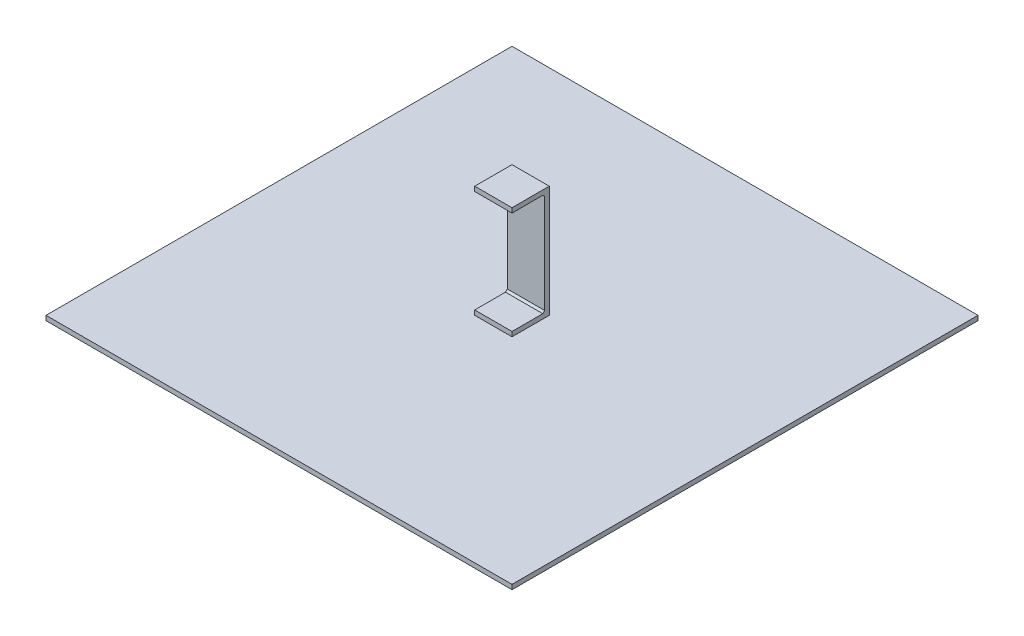
ISO-10303-21;
HEADER;
FILE_DESCRIPTION(('STEP AP214'),'2;1');
FILE_NAME('part.step','',(''),(''),'','','');
FILE_SCHEMA(('AUTOMOTIVE_DESIGN { 1 0 10303 214 1 1 1 1 }'));
ENDSEC;
DATA;
#1=APPLICATION_CONTEXT('core data for automotive mechanical design processes');
#2=APPLICATION_PROTOCOL_DEFINITION('international standard','automotive_design',2000,#1);
#3=PRODUCT_CONTEXT('',#1,'mechanical');
#4=PRODUCT('Part','Part','',(#3));
#5=PRODUCT_RELATED_PRODUCT_CATEGORY('part','',(#4));
#6=PRODUCT_DEFINITION_FORMATION('','',#4);
#7=PRODUCT_DEFINITION_CONTEXT('part definition',#1,'design');
#8=PRODUCT_DEFINITION('design','',#6,#7);
#9=PRODUCT_DEFINITION_SHAPE('','',#8);
#10=(LENGTH_UNIT() NAMED_UNIT(*) SI_UNIT(.MILLI.,.METRE.));
#11=(NAMED_UNIT(*) PLANE_ANGLE_UNIT() SI_UNIT($,.RADIAN.));
#12=(NAMED_UNIT(*) SI_UNIT($,.STERADIAN.) SOLID_ANGLE_UNIT());
#13=UNCERTAINTY_MEASURE_WITH_UNIT(LENGTH_MEASURE(1.E-05),#10,'distance_accuracy_value','');
#14=(GEOMETRIC_REPRESENTATION_CONTEXT(3) GLOBAL_UNCERTAINTY_ASSIGNED_CONTEXT((#13)) GLOBAL_UNIT_ASSIGNED_CONTEXT((#10,
#11,#12)) REPRESENTATION_CONTEXT('',''));
#15=CARTESIAN_POINT('',(0.,0.,0.));
#16=DIRECTION('',(0.,0.,1.));
#17=DIRECTION('',(1.,0.,0.));
#18=AXIS2_PLACEMENT_3D('',#15,#16,#17);
#19=CARTESIAN_POINT('',(0.,-1200.,0.));
#20=DIRECTION('',(0.,-1.,0.));
#21=DIRECTION('',(0.,0.,-1.));
#22=AXIS2_PLACEMENT_3D('',#19,#20,#21);
#23=PLANE('',#22);
#24=DIRECTION('',(0.,0.,1.));
#25=VECTOR('',#24,1.);
#26=CARTESIAN_POINT('',(2700.,-1200.,2404.98516938128));
#27=LINE('',#26,#25);
#28=CARTESIAN_POINT('',(2700.,-1200.,-2595.01483061872));
#29=VERTEX_POINT('',#28);
#30=CARTESIAN_POINT('',(2700.,-1200.,2404.98516938128));
#31=VERTEX_POINT('',#30);
#32=EDGE_CURVE('E146',#29,#31,#27,.T.);
#33=ORIENTED_EDGE('',*,*,#32,.T.);
#34=DIRECTION('',(-1.,0.,0.));
#35=VECTOR('',#34,1.);
#36=CARTESIAN_POINT('',(-2300.,-1200.,2404.98516938128));
#37=LINE('',#36,#35);
#38=CARTESIAN_POINT('',(-2300.,-1200.,2404.98516938128));
#39=VERTEX_POINT('',#38);
#40=EDGE_CURVE('E149',#31,#39,#37,.T.);
#41=ORIENTED_EDGE('',*,*,#40,.T.);
#42=DIRECTION('',(0.,0.,-1.));
#43=VECTOR('',#42,1.);
#44=CARTESIAN_POINT('',(-2300.,-1200.,2404.98516938128));
#45=LINE('',#44,#43);
#46=CARTESIAN_POINT('',(-2300.,-1200.,-2595.01483061872));
#47=VERTEX_POINT('',#46);
#48=EDGE_CURVE('E152',#39,#47,#45,.T.);
#49=ORIENTED_EDGE('',*,*,#48,.T.);
#50=DIRECTION('',(1.,0.,0.));
#51=VECTOR('',#50,1.);
#52=CARTESIAN_POINT('',(-2300.,-1200.,-2595.01483061872));
#53=LINE('',#52,#51);
#54=EDGE_CURVE('E154',#47,#29,#53,.T.);
#55=ORIENTED_EDGE('',*,*,#54,.T.);
#56=EDGE_LOOP('',(#33,#41,#49,#55));
#57=FACE_BOUND('',#56,.T.);
#58=DIRECTION('',(0.,0.,-1.));
#59=VECTOR('',#58,1.);
#60=CARTESIAN_POINT('',(0.,-1200.,104.985169381277));
#61=LINE('',#60,#59);
#62=CARTESIAN_POINT('',(0.,-1200.,104.985169381277));
#63=VERTEX_POINT('',#62);
#64=CARTESIAN_POINT('',(0.,-1200.,-295.014830618723));
#65=VERTEX_POINT('',#64);
#66=EDGE_CURVE('E118',#63,#65,#61,.T.);
#67=ORIENTED_EDGE('',*,*,#66,.F.);
#68=DIRECTION('',(-1.,0.,0.));
#69=VECTOR('',#68,1.);
#70=CARTESIAN_POINT('',(400.,-1200.,104.985169381277));
#71=LINE('',#70,#69);
#72=CARTESIAN_POINT('',(400.,-1200.,104.985169381277));
#73=VERTEX_POINT('',#72);
#74=EDGE_CURVE('E110',#73,#63,#71,.T.);
#75=ORIENTED_EDGE('',*,*,#74,.F.);
#76=DIRECTION('',(0.,0.,1.));
#77=VECTOR('',#76,1.);
#78=CARTESIAN_POINT('',(400.,-1200.,-295.014830618723));
#79=LINE('',#78,#77);
#80=CARTESIAN_POINT('',(400.,-1200.,-295.014830618723));
#81=VERTEX_POINT('',#80);
#82=EDGE_CURVE('E132',#81,#73,#79,.T.);
#83=ORIENTED_EDGE('',*,*,#82,.F.);
#84=DIRECTION('',(1.,0.,0.));
#85=VECTOR('',#84,1.);
#86=CARTESIAN_POINT('',(0.,-1200.,-295.014830618723));
#87=LINE('',#86,#85);
#88=EDGE_CURVE('E130',#65,#81,#87,.T.);
#89=ORIENTED_EDGE('',*,*,#88,.F.);
#90=EDGE_LOOP('',(#67,#75,#83,#89));
#91=FACE_BOUND('',#90,.T.);
#92=ADVANCED_FACE('F45',(#57,#91),#23,.T.);
#93=CARTESIAN_POINT('',(0.,-1150.,0.));
#94=DIRECTION('',(0.,-1.,0.));
#95=DIRECTION('',(0.,0.,-1.));
#96=AXIS2_PLACEMENT_3D('',#93,#94,#95);
#97=PLANE('',#96);
#98=DIRECTION('',(0.,0.,1.));
#99=VECTOR('',#98,1.);
#100=CARTESIAN_POINT('',(2700.,-1150.,2404.98516938128));
#101=LINE('',#100,#99);
#102=CARTESIAN_POINT('',(2700.,-1150.,-2595.01483061872));
#103=VERTEX_POINT('',#102);
#104=CARTESIAN_POINT('',(2700.,-1150.,2404.98516938128));
#105=VERTEX_POINT('',#104);
#106=EDGE_CURVE('E126',#103,#105,#101,.T.);
#107=ORIENTED_EDGE('',*,*,#106,.F.);
#108=DIRECTION('',(1.,0.,0.));
#109=VECTOR('',#108,1.);
#110=CARTESIAN_POINT('',(-2300.,-1150.,-2595.01483061872));
#111=LINE('',#110,#109);
#112=CARTESIAN_POINT('',(-2300.,-1150.,-2595.01483061872));
#113=VERTEX_POINT('',#112);
#114=EDGE_CURVE('E150',#113,#103,#111,.T.);
#115=ORIENTED_EDGE('',*,*,#114,.F.);
#116=DIRECTION('',(0.,0.,-1.));
#117=VECTOR('',#116,1.);
#118=CARTESIAN_POINT('',(-2300.,-1150.,2404.98516938128));
#119=LINE('',#118,#117);
#120=CARTESIAN_POINT('',(-2300.,-1150.,2404.98516938128));
#121=VERTEX_POINT('',#120);
#122=EDGE_CURVE('E161',#121,#113,#119,.T.);
#123=ORIENTED_EDGE('',*,*,#122,.F.);
#124=DIRECTION('',(-1.,0.,0.));
#125=VECTOR('',#124,1.);
#126=CARTESIAN_POINT('',(-2300.,-1150.,2404.98516938128));
#127=LINE('',#126,#125);
#128=EDGE_CURVE('E159',#105,#121,#127,.T.);
#129=ORIENTED_EDGE('',*,*,#128,.F.);
#130=EDGE_LOOP('',(#107,#115,#123,#129));
#131=FACE_BOUND('',#130,.T.);
#132=DIRECTION('',(-1.,0.,0.));
#133=VECTOR('',#132,1.);
#134=CARTESIAN_POINT('',(400.,-1150.,104.985169381277));
#135=LINE('',#134,#133);
#136=CARTESIAN_POINT('',(400.,-1150.,104.985169381277));
#137=VERTEX_POINT('',#136);
#138=CARTESIAN_POINT('',(0.,-1150.,104.985169381277));
#139=VERTEX_POINT('',#138);
#140=EDGE_CURVE('E68',#137,#139,#135,.T.);
#141=ORIENTED_EDGE('',*,*,#140,.T.);
#142=DIRECTION('',(0.,0.,-1.));
#143=VECTOR('',#142,1.);
#144=CARTESIAN_POINT('',(0.,-1150.,104.985169381277));
#145=LINE('',#144,#143);
#146=CARTESIAN_POINT('',(0.,-1150.,-295.014830618723));
#147=VERTEX_POINT('',#146);
#148=EDGE_CURVE('E125',#139,#147,#145,.T.);
#149=ORIENTED_EDGE('',*,*,#148,.T.);
#150=DIRECTION('',(1.,0.,0.));
#151=VECTOR('',#150,1.);
#152=CARTESIAN_POINT('',(0.,-1150.,-295.014830618723));
#153=LINE('',#152,#151);
#154=CARTESIAN_POINT('',(400.,-1150.,-295.014830618723));
#155=VERTEX_POINT('',#154);
#156=EDGE_CURVE('E138',#147,#155,#153,.T.);
#157=ORIENTED_EDGE('',*,*,#156,.T.);
#158=DIRECTION('',(0.,0.,1.));
#159=VECTOR('',#158,1.);
#160=CARTESIAN_POINT('',(400.,-1150.,-295.014830618723));
#161=LINE('',#160,#159);
#162=EDGE_CURVE('E119',#155,#137,#161,.T.);
#163=ORIENTED_EDGE('',*,*,#162,.T.);
#164=EDGE_LOOP('',(#141,#149,#157,#163));
#165=FACE_BOUND('',#164,.T.);
#166=ADVANCED_FACE('F179',(#131,#165),#97,.F.);
#167=CARTESIAN_POINT('',(2700.,-1200.,2404.98516938128));
#168=DIRECTION('',(-1.,0.,0.));
#169=DIRECTION('',(0.,0.,1.));
#170=AXIS2_PLACEMENT_3D('',#167,#168,#169);
#171=PLANE('',#170);
#172=ORIENTED_EDGE('',*,*,#106,.T.);
#173=DIRECTION('',(0.,1.,0.));
#174=VECTOR('',#173,1.);
#175=CARTESIAN_POINT('',(2700.,-1200.,2404.98516938128));
#176=LINE('',#175,#174);
#177=EDGE_CURVE('E12',#31,#105,#176,.T.);
#178=ORIENTED_EDGE('',*,*,#177,.F.);
#179=ORIENTED_EDGE('',*,*,#32,.F.);
#180=DIRECTION('',(0.,1.,0.));
#181=VECTOR('',#180,1.);
#182=CARTESIAN_POINT('',(2700.,-1200.,-2595.01483061872));
#183=LINE('',#182,#181);
#184=EDGE_CURVE('E156',#29,#103,#183,.T.);
#185=ORIENTED_EDGE('',*,*,#184,.T.);
#186=EDGE_LOOP('',(#172,#178,#179,#185));
#187=FACE_BOUND('',#186,.T.);
#188=ADVANCED_FACE('F47',(#187),#171,.F.);
#189=CARTESIAN_POINT('',(-2300.,-1200.,2404.98516938128));
#190=DIRECTION('',(0.,0.,-1.));
#191=DIRECTION('',(-1.,0.,0.));
#192=AXIS2_PLACEMENT_3D('',#189,#190,#191);
#193=PLANE('',#192);
#194=ORIENTED_EDGE('',*,*,#128,.T.);
#195=DIRECTION('',(0.,1.,0.));
#196=VECTOR('',#195,1.);
#197=CARTESIAN_POINT('',(-2300.,-1200.,2404.98516938128));
#198=LINE('',#197,#196);
#199=EDGE_CURVE('E53',#39,#121,#198,.T.);
#200=ORIENTED_EDGE('',*,*,#199,.F.);
#201=ORIENTED_EDGE('',*,*,#40,.F.);
#202=ORIENTED_EDGE('',*,*,#177,.T.);
#203=EDGE_LOOP('',(#194,#200,#201,#202));
#204=FACE_BOUND('',#203,.T.);
#205=ADVANCED_FACE('F189',(#204),#193,.F.);
#206=CARTESIAN_POINT('',(-2300.,-1200.,2404.98516938128));
#207=DIRECTION('',(1.,0.,0.));
#208=DIRECTION('',(0.,0.,-1.));
#209=AXIS2_PLACEMENT_3D('',#206,#207,#208);
#210=PLANE('',#209);
#211=ORIENTED_EDGE('',*,*,#122,.T.);
#212=DIRECTION('',(0.,1.,0.));
#213=VECTOR('',#212,1.);
#214=CARTESIAN_POINT('',(-2300.,-1200.,-2595.01483061872));
#215=LINE('',#214,#213);
#216=EDGE_CURVE('E166',#47,#113,#215,.T.);
#217=ORIENTED_EDGE('',*,*,#216,.F.);
#218=ORIENTED_EDGE('',*,*,#48,.F.);
#219=ORIENTED_EDGE('',*,*,#199,.T.);
#220=EDGE_LOOP('',(#211,#217,#218,#219));
#221=FACE_BOUND('',#220,.T.);
#222=ADVANCED_FACE('F173',(#221),#210,.F.);
#223=CARTESIAN_POINT('',(-2300.,-1200.,-2595.01483061872));
#224=DIRECTION('',(0.,0.,1.));
#225=DIRECTION('',(1.,0.,0.));
#226=AXIS2_PLACEMENT_3D('',#223,#224,#225);
#227=PLANE('',#226);
#228=ORIENTED_EDGE('',*,*,#114,.T.);
#229=ORIENTED_EDGE('',*,*,#184,.F.);
#230=ORIENTED_EDGE('',*,*,#54,.F.);
#231=ORIENTED_EDGE('',*,*,#216,.T.);
#232=EDGE_LOOP('',(#228,#229,#230,#231));
#233=FACE_BOUND('',#232,.T.);
#234=ADVANCED_FACE('F183',(#233),#227,.F.);
#235=CARTESIAN_POINT('',(400.,-1200.,104.985169381277));
#236=DIRECTION('',(0.,0.,-1.));
#237=DIRECTION('',(-1.,0.,0.));
#238=AXIS2_PLACEMENT_3D('',#235,#236,#237);
#239=PLANE('',#238);
#240=ORIENTED_EDGE('',*,*,#140,.F.);
#241=DIRECTION('',(0.,1.,0.));
#242=VECTOR('',#241,1.);
#243=CARTESIAN_POINT('',(400.,-1200.,104.985169381277));
#244=LINE('',#243,#242);
#245=EDGE_CURVE('E114',#73,#137,#244,.T.);
#246=ORIENTED_EDGE('',*,*,#245,.F.);
#247=ORIENTED_EDGE('',*,*,#74,.T.);
#248=DIRECTION('',(0.,1.,0.));
#249=VECTOR('',#248,1.);
#250=CARTESIAN_POINT('',(0.,-1200.,104.985169381277));
#251=LINE('',#250,#249);
#252=EDGE_CURVE('E113',#63,#139,#251,.T.);
#253=ORIENTED_EDGE('',*,*,#252,.T.);
#254=EDGE_LOOP('',(#240,#246,#247,#253));
#255=FACE_BOUND('',#254,.T.);
#256=ADVANCED_FACE('F112',(#255),#239,.T.);
#257=CARTESIAN_POINT('',(0.,-1200.,104.985169381277));
#258=DIRECTION('',(1.,0.,0.));
#259=DIRECTION('',(0.,0.,-1.));
#260=AXIS2_PLACEMENT_3D('',#257,#258,#259);
#261=PLANE('',#260);
#262=ORIENTED_EDGE('',*,*,#148,.F.);
#263=ORIENTED_EDGE('',*,*,#252,.F.);
#264=ORIENTED_EDGE('',*,*,#66,.T.);
#265=DIRECTION('',(0.,1.,0.));
#266=VECTOR('',#265,1.);
#267=CARTESIAN_POINT('',(0.,-1200.,-295.014830618723));
#268=LINE('',#267,#266);
#269=EDGE_CURVE('E127',#65,#147,#268,.T.);
#270=ORIENTED_EDGE('',*,*,#269,.T.);
#271=EDGE_LOOP('',(#262,#263,#264,#270));
#272=FACE_BOUND('',#271,.T.);
#273=ADVANCED_FACE('F122',(#272),#261,.T.);
#274=CARTESIAN_POINT('',(0.,-1200.,-295.014830618723));
#275=DIRECTION('',(0.,0.,1.));
#276=DIRECTION('',(1.,0.,0.));
#277=AXIS2_PLACEMENT_3D('',#274,#275,#276);
#278=PLANE('',#277);
#279=ORIENTED_EDGE('',*,*,#156,.F.);
#280=ORIENTED_EDGE('',*,*,#269,.F.);
#281=ORIENTED_EDGE('',*,*,#88,.T.);
#282=DIRECTION('',(0.,1.,0.));
#283=VECTOR('',#282,1.);
#284=CARTESIAN_POINT('',(400.,-1200.,-295.014830618723));
#285=LINE('',#284,#283);
#286=EDGE_CURVE('E60',#81,#155,#285,.T.);
#287=ORIENTED_EDGE('',*,*,#286,.T.);
#288=EDGE_LOOP('',(#279,#280,#281,#287));
#289=FACE_BOUND('',#288,.T.);
#290=ADVANCED_FACE('F212',(#289),#278,.T.);
#291=CARTESIAN_POINT('',(400.,-1200.,-295.014830618723));
#292=DIRECTION('',(-1.,0.,0.));
#293=DIRECTION('',(0.,0.,1.));
#294=AXIS2_PLACEMENT_3D('',#291,#292,#293);
#295=PLANE('',#294);
#296=ORIENTED_EDGE('',*,*,#162,.F.);
#297=ORIENTED_EDGE('',*,*,#286,.F.);
#298=ORIENTED_EDGE('',*,*,#82,.T.);
#299=ORIENTED_EDGE('',*,*,#245,.T.);
#300=EDGE_LOOP('',(#296,#297,#298,#299));
#301=FACE_BOUND('',#300,.T.);
#302=ADVANCED_FACE('F216',(#301),#295,.T.);
#303=CLOSED_SHELL('',(#92,#166,#188,#205,#222,#234,#256,#273,#290,#302));
#304=MANIFOLD_SOLID_BREP('B2',#303);
#305=CARTESIAN_POINT('',(400.,0.,104.985169381277));
#306=DIRECTION('',(0.,0.,-1.));
#307=DIRECTION('',(-1.,0.,0.));
#308=AXIS2_PLACEMENT_3D('',#305,#306,#307);
#309=PLANE('',#308);
#310=DIRECTION('',(0.,-1.,0.));
#311=VECTOR('',#310,1.);
#312=CARTESIAN_POINT('',(0.,0.,104.985169381277));
#313=LINE('',#312,#311);
#314=CARTESIAN_POINT('',(0.,50.,104.985169381277));
#315=VERTEX_POINT('',#314);
#316=CARTESIAN_POINT('',(0.,0.,104.985169381277));
#317=VERTEX_POINT('',#316);
#318=EDGE_CURVE('E370',#315,#317,#313,.T.);
#319=ORIENTED_EDGE('',*,*,#318,.T.);
#320=DIRECTION('',(-1.,0.,0.));
#321=VECTOR('',#320,1.);
#322=CARTESIAN_POINT('',(400.,0.,104.985169381277));
#323=LINE('',#322,#321);
#324=CARTESIAN_POINT('',(400.,0.,104.985169381277));
#325=VERTEX_POINT('',#324);
#326=EDGE_CURVE('E353',#325,#317,#323,.T.);
#327=ORIENTED_EDGE('',*,*,#326,.F.);
#328=DIRECTION('',(0.,-1.,0.));
#329=VECTOR('',#328,1.);
#330=CARTESIAN_POINT('',(400.,0.,104.985169381277));
#331=LINE('',#330,#329);
#332=CARTESIAN_POINT('',(400.,50.,104.985169381277));
#333=VERTEX_POINT('',#332);
#334=EDGE_CURVE('E358',#333,#325,#331,.T.);
#335=ORIENTED_EDGE('',*,*,#334,.F.);
#336=DIRECTION('',(-1.,0.,0.));
#337=VECTOR('',#336,1.);
#338=CARTESIAN_POINT('',(400.,50.,104.985169381277));
#339=LINE('',#338,#337);
#340=EDGE_CURVE('E427',#333,#315,#339,.T.);
#341=ORIENTED_EDGE('',*,*,#340,.T.);
#342=EDGE_LOOP('',(#319,#327,#335,#341));
#343=FACE_BOUND('',#342,.T.);
#344=ADVANCED_FACE('F275',(#343),#309,.F.);
#345=CARTESIAN_POINT('',(400.,0.,-245.014830618723));
#346=DIRECTION('',(0.,1.,0.));
#347=DIRECTION('',(0.,0.,1.));
#348=AXIS2_PLACEMENT_3D('',#345,#346,#347);
#349=PLANE('',#348);
#350=DIRECTION('',(0.,0.,-1.));
#351=VECTOR('',#350,1.);
#352=CARTESIAN_POINT('',(0.,0.,-245.014830618723));
#353=LINE('',#352,#351);
#354=CARTESIAN_POINT('',(0.,0.,-225.014830618723));
#355=VERTEX_POINT('',#354);
#356=EDGE_CURVE('E414',#317,#355,#353,.T.);
#357=ORIENTED_EDGE('',*,*,#356,.T.);
#358=DIRECTION('',(1.,0.,0.));
#359=VECTOR('',#358,1.);
#360=CARTESIAN_POINT('',(400.,0.,-225.014830618723));
#361=LINE('',#360,#359);
#362=CARTESIAN_POINT('',(400.,0.,-225.014830618723));
#363=VERTEX_POINT('',#362);
#364=EDGE_CURVE('E291',#355,#363,#361,.T.);
#365=ORIENTED_EDGE('',*,*,#364,.T.);
#366=DIRECTION('',(0.,0.,-1.));
#367=VECTOR('',#366,1.);
#368=CARTESIAN_POINT('',(400.,0.,-245.014830618723));
#369=LINE('',#368,#367);
#370=EDGE_CURVE('E349',#325,#363,#369,.T.);
#371=ORIENTED_EDGE('',*,*,#370,.F.);
#372=ORIENTED_EDGE('',*,*,#326,.T.);
#373=EDGE_LOOP('',(#357,#365,#371,#372));
#374=FACE_BOUND('',#373,.T.);
#375=ADVANCED_FACE('F351',(#374),#349,.F.);
#376=CARTESIAN_POINT('',(400.,-1100.,-245.014830618723));
#377=DIRECTION('',(0.,0.,-1.));
#378=DIRECTION('',(-1.,0.,0.));
#379=AXIS2_PLACEMENT_3D('',#376,#377,#378);
#380=PLANE('',#379);
#381=DIRECTION('',(0.,-1.,0.));
#382=VECTOR('',#381,1.);
#383=CARTESIAN_POINT('',(0.,-1100.,-245.014830618723));
#384=LINE('',#383,#382);
#385=CARTESIAN_POINT('',(0.,-20.0000000000002,-245.014830618723));
#386=VERTEX_POINT('',#385);
#387=CARTESIAN_POINT('',(0.,-1080.,-245.014830618723));
#388=VERTEX_POINT('',#387);
#389=EDGE_CURVE('E408',#386,#388,#384,.T.);
#390=ORIENTED_EDGE('',*,*,#389,.T.);
#391=DIRECTION('',(1.,0.,0.));
#392=VECTOR('',#391,1.);
#393=CARTESIAN_POINT('',(400.,-1080.,-245.014830618723));
#394=LINE('',#393,#392);
#395=CARTESIAN_POINT('',(400.,-1080.,-245.014830618723));
#396=VERTEX_POINT('',#395);
#397=EDGE_CURVE('E384',#388,#396,#394,.T.);
#398=ORIENTED_EDGE('',*,*,#397,.T.);
#399=DIRECTION('',(0.,-1.,0.));
#400=VECTOR('',#399,1.);
#401=CARTESIAN_POINT('',(400.,-1100.,-245.014830618723));
#402=LINE('',#401,#400);
#403=CARTESIAN_POINT('',(400.,-20.0000000000002,-245.014830618723));
#404=VERTEX_POINT('',#403);
#405=EDGE_CURVE('E357',#404,#396,#402,.T.);
#406=ORIENTED_EDGE('',*,*,#405,.F.);
#407=DIRECTION('',(-1.,0.,0.));
#408=VECTOR('',#407,1.);
#409=CARTESIAN_POINT('',(0.,-20.0000000000002,-245.014830618723));
#410=LINE('',#409,#408);
#411=EDGE_CURVE('E375',#404,#386,#410,.T.);
#412=ORIENTED_EDGE('',*,*,#411,.T.);
#413=EDGE_LOOP('',(#390,#398,#406,#412));
#414=FACE_BOUND('',#413,.T.);
#415=ADVANCED_FACE('F412',(#414),#380,.F.);
#416=CARTESIAN_POINT('',(400.,-1100.,104.985169381277));
#417=DIRECTION('',(0.,-1.,0.));
#418=DIRECTION('',(0.,0.,-1.));
#419=AXIS2_PLACEMENT_3D('',#416,#417,#418);
#420=PLANE('',#419);
#421=DIRECTION('',(0.,0.,1.));
#422=VECTOR('',#421,1.);
#423=CARTESIAN_POINT('',(400.,-1100.,104.985169381277));
#424=LINE('',#423,#422);
#425=CARTESIAN_POINT('',(400.,-1100.,-225.014830618723));
#426=VERTEX_POINT('',#425);
#427=CARTESIAN_POINT('',(400.,-1100.,104.985169381277));
#428=VERTEX_POINT('',#427);
#429=EDGE_CURVE('E393',#426,#428,#424,.T.);
#430=ORIENTED_EDGE('',*,*,#429,.F.);
#431=DIRECTION('',(-1.,0.,0.));
#432=VECTOR('',#431,1.);
#433=CARTESIAN_POINT('',(0.,-1100.,-225.014830618723));
#434=LINE('',#433,#432);
#435=CARTESIAN_POINT('',(0.,-1100.,-225.014830618723));
#436=VERTEX_POINT('',#435);
#437=EDGE_CURVE('E371',#426,#436,#434,.T.);
#438=ORIENTED_EDGE('',*,*,#437,.T.);
#439=DIRECTION('',(0.,0.,1.));
#440=VECTOR('',#439,1.);
#441=CARTESIAN_POINT('',(0.,-1100.,104.985169381277));
#442=LINE('',#441,#440);
#443=CARTESIAN_POINT('',(0.,-1100.,104.985169381277));
#444=VERTEX_POINT('',#443);
#445=EDGE_CURVE('E410',#436,#444,#442,.T.);
#446=ORIENTED_EDGE('',*,*,#445,.T.);
#447=DIRECTION('',(-1.,0.,0.));
#448=VECTOR('',#447,1.);
#449=CARTESIAN_POINT('',(400.,-1100.,104.985169381277));
#450=LINE('',#449,#448);
#451=EDGE_CURVE('E372',#428,#444,#450,.T.);
#452=ORIENTED_EDGE('',*,*,#451,.F.);
#453=EDGE_LOOP('',(#430,#438,#446,#452));
#454=FACE_BOUND('',#453,.T.);
#455=ADVANCED_FACE('F400',(#454),#420,.F.);
#456=CARTESIAN_POINT('',(400.,-1150.,104.985169381277));
#457=DIRECTION('',(0.,0.,-1.));
#458=DIRECTION('',(-1.,0.,0.));
#459=AXIS2_PLACEMENT_3D('',#456,#457,#458);
#460=PLANE('',#459);
#461=DIRECTION('',(0.,-1.,0.));
#462=VECTOR('',#461,1.);
#463=CARTESIAN_POINT('',(0.,-1150.,104.985169381277));
#464=LINE('',#463,#462);
#465=CARTESIAN_POINT('',(0.,-1150.,104.985169381277));
#466=VERTEX_POINT('',#465);
#467=EDGE_CURVE('E416',#444,#466,#464,.T.);
#468=ORIENTED_EDGE('',*,*,#467,.T.);
#469=DIRECTION('',(-1.,0.,0.));
#470=VECTOR('',#469,1.);
#471=CARTESIAN_POINT('',(400.,-1150.,104.985169381277));
#472=LINE('',#471,#470);
#473=CARTESIAN_POINT('',(400.,-1150.,104.985169381277));
#474=VERTEX_POINT('',#473);
#475=EDGE_CURVE('E378',#474,#466,#472,.T.);
#476=ORIENTED_EDGE('',*,*,#475,.F.);
#477=DIRECTION('',(0.,-1.,0.));
#478=VECTOR('',#477,1.);
#479=CARTESIAN_POINT('',(400.,-1150.,104.985169381277));
#480=LINE('',#479,#478);
#481=EDGE_CURVE('E403',#428,#474,#480,.T.);
#482=ORIENTED_EDGE('',*,*,#481,.F.);
#483=ORIENTED_EDGE('',*,*,#451,.T.);
#484=EDGE_LOOP('',(#468,#476,#482,#483));
#485=FACE_BOUND('',#484,.T.);
#486=ADVANCED_FACE('F457',(#485),#460,.F.);
#487=CARTESIAN_POINT('',(400.,-1150.,-295.014830618723));
#488=DIRECTION('',(0.,1.,0.));
#489=DIRECTION('',(0.,0.,1.));
#490=AXIS2_PLACEMENT_3D('',#487,#488,#489);
#491=PLANE('',#490);
#492=DIRECTION('',(0.,0.,-1.));
#493=VECTOR('',#492,1.);
#494=CARTESIAN_POINT('',(0.,-1150.,-295.014830618723));
#495=LINE('',#494,#493);
#496=CARTESIAN_POINT('',(0.,-1150.,-295.014830618723));
#497=VERTEX_POINT('',#496);
#498=EDGE_CURVE('E422',#466,#497,#495,.T.);
#499=ORIENTED_EDGE('',*,*,#498,.T.);
#500=DIRECTION('',(-1.,0.,0.));
#501=VECTOR('',#500,1.);
#502=CARTESIAN_POINT('',(400.,-1150.,-295.014830618723));
#503=LINE('',#502,#501);
#504=CARTESIAN_POINT('',(400.,-1150.,-295.014830618723));
#505=VERTEX_POINT('',#504);
#506=EDGE_CURVE('E432',#505,#497,#503,.T.);
#507=ORIENTED_EDGE('',*,*,#506,.F.);
#508=DIRECTION('',(0.,0.,-1.));
#509=VECTOR('',#508,1.);
#510=CARTESIAN_POINT('',(400.,-1150.,-295.014830618723));
#511=LINE('',#510,#509);
#512=EDGE_CURVE('E441',#474,#505,#511,.T.);
#513=ORIENTED_EDGE('',*,*,#512,.F.);
#514=ORIENTED_EDGE('',*,*,#475,.T.);
#515=EDGE_LOOP('',(#499,#507,#513,#514));
#516=FACE_BOUND('',#515,.T.);
#517=ADVANCED_FACE('F439',(#516),#491,.F.);
#518=CARTESIAN_POINT('',(400.,50.,-295.014830618723));
#519=DIRECTION('',(0.,0.,1.));
#520=DIRECTION('',(0.,-1.,0.));
#521=AXIS2_PLACEMENT_3D('',#518,#519,#520);
#522=PLANE('',#521);
#523=DIRECTION('',(0.,1.,0.));
#524=VECTOR('',#523,1.);
#525=CARTESIAN_POINT('',(0.,50.,-295.014830618723));
#526=LINE('',#525,#524);
#527=CARTESIAN_POINT('',(0.,50.,-295.014830618723));
#528=VERTEX_POINT('',#527);
#529=EDGE_CURVE('E424',#497,#528,#526,.T.);
#530=ORIENTED_EDGE('',*,*,#529,.T.);
#531=DIRECTION('',(-1.,0.,0.));
#532=VECTOR('',#531,1.);
#533=CARTESIAN_POINT('',(400.,50.,-295.014830618723));
#534=LINE('',#533,#532);
#535=CARTESIAN_POINT('',(400.,50.,-295.014830618723));
#536=VERTEX_POINT('',#535);
#537=EDGE_CURVE('E429',#536,#528,#534,.T.);
#538=ORIENTED_EDGE('',*,*,#537,.F.);
#539=DIRECTION('',(0.,1.,0.));
#540=VECTOR('',#539,1.);
#541=CARTESIAN_POINT('',(400.,50.,-295.014830618723));
#542=LINE('',#541,#540);
#543=EDGE_CURVE('E451',#505,#536,#542,.T.);
#544=ORIENTED_EDGE('',*,*,#543,.F.);
#545=ORIENTED_EDGE('',*,*,#506,.T.);
#546=EDGE_LOOP('',(#530,#538,#544,#545));
#547=FACE_BOUND('',#546,.T.);
#548=ADVANCED_FACE('F447',(#547),#522,.F.);
#549=CARTESIAN_POINT('',(400.,50.,104.985169381277));
#550=DIRECTION('',(0.,-1.,0.));
#551=DIRECTION('',(0.,0.,-1.));
#552=AXIS2_PLACEMENT_3D('',#549,#550,#551);
#553=PLANE('',#552);
#554=DIRECTION('',(0.,0.,1.));
#555=VECTOR('',#554,1.);
#556=CARTESIAN_POINT('',(0.,50.,104.985169381277));
#557=LINE('',#556,#555);
#558=EDGE_CURVE('E367',#528,#315,#557,.T.);
#559=ORIENTED_EDGE('',*,*,#558,.T.);
#560=ORIENTED_EDGE('',*,*,#340,.F.);
#561=DIRECTION('',(0.,0.,1.));
#562=VECTOR('',#561,1.);
#563=CARTESIAN_POINT('',(400.,50.,104.985169381277));
#564=LINE('',#563,#562);
#565=EDGE_CURVE('E363',#536,#333,#564,.T.);
#566=ORIENTED_EDGE('',*,*,#565,.F.);
#567=ORIENTED_EDGE('',*,*,#537,.T.);
#568=EDGE_LOOP('',(#559,#560,#566,#567));
#569=FACE_BOUND('',#568,.T.);
#570=ADVANCED_FACE('F450',(#569),#553,.F.);
#571=CARTESIAN_POINT('',(400.,0.,0.));
#572=DIRECTION('',(-1.,0.,0.));
#573=DIRECTION('',(0.,0.,1.));
#574=AXIS2_PLACEMENT_3D('',#571,#572,#573);
#575=PLANE('',#574);
#576=ORIENTED_EDGE('',*,*,#334,.T.);
#577=ORIENTED_EDGE('',*,*,#370,.T.);
#578=DIRECTION('',(0.,0.707106781186551,0.707106781186544));
#579=VECTOR('',#578,1.);
#580=CARTESIAN_POINT('',(400.,112.507415309362,-112.507415309363));
#581=LINE('',#580,#579);
#582=EDGE_CURVE('E43',#363,#404,#581,.F.);
#583=ORIENTED_EDGE('',*,*,#582,.T.);
#584=ORIENTED_EDGE('',*,*,#405,.T.);
#585=DIRECTION('',(0.,0.707106781186542,-0.707106781186553));
#586=VECTOR('',#585,1.);
#587=CARTESIAN_POINT('',(400.,-662.507415309371,-662.50741530936));
#588=LINE('',#587,#586);
#589=EDGE_CURVE('E389',#396,#426,#588,.F.);
#590=ORIENTED_EDGE('',*,*,#589,.T.);
#591=ORIENTED_EDGE('',*,*,#429,.T.);
#592=ORIENTED_EDGE('',*,*,#481,.T.);
#593=ORIENTED_EDGE('',*,*,#512,.T.);
#594=ORIENTED_EDGE('',*,*,#543,.T.);
#595=ORIENTED_EDGE('',*,*,#565,.T.);
#596=EDGE_LOOP('',(#576,#577,#583,#584,#590,#591,#592,#593,#594,#595));
#597=FACE_BOUND('',#596,.T.);
#598=ADVANCED_FACE('F361',(#597),#575,.F.);
#599=CARTESIAN_POINT('',(0.,0.,0.));
#600=DIRECTION('',(-1.,0.,0.));
#601=DIRECTION('',(0.,0.,1.));
#602=AXIS2_PLACEMENT_3D('',#599,#600,#601);
#603=PLANE('',#602);
#604=ORIENTED_EDGE('',*,*,#318,.F.);
#605=ORIENTED_EDGE('',*,*,#558,.F.);
#606=ORIENTED_EDGE('',*,*,#529,.F.);
#607=ORIENTED_EDGE('',*,*,#498,.F.);
#608=ORIENTED_EDGE('',*,*,#467,.F.);
#609=ORIENTED_EDGE('',*,*,#445,.F.);
#610=DIRECTION('',(0.,-0.707106781186542,0.707106781186553));
#611=VECTOR('',#610,1.);
#612=CARTESIAN_POINT('',(0.,-1100.,-225.014830618723));
#613=LINE('',#612,#611);
#614=EDGE_CURVE('E387',#436,#388,#613,.F.);
#615=ORIENTED_EDGE('',*,*,#614,.T.);
#616=ORIENTED_EDGE('',*,*,#389,.F.);
#617=DIRECTION('',(0.,-0.707106781186551,-0.707106781186544));
#618=VECTOR('',#617,1.);
#619=CARTESIAN_POINT('',(0.,-20.0000000000002,-245.014830618723));
#620=LINE('',#619,#618);
#621=EDGE_CURVE('E284',#386,#355,#620,.F.);
#622=ORIENTED_EDGE('',*,*,#621,.T.);
#623=ORIENTED_EDGE('',*,*,#356,.F.);
#624=EDGE_LOOP('',(#604,#605,#606,#607,#608,#609,#615,#616,#622,#623));
#625=FACE_BOUND('',#624,.T.);
#626=ADVANCED_FACE('F407',(#625),#603,.T.);
#627=CARTESIAN_POINT('',(400.,-1100.,-225.014830618723));
#628=DIRECTION('',(0.,0.707106781186553,0.707106781186542));
#629=DIRECTION('',(1.,0.,0.));
#630=AXIS2_PLACEMENT_3D('',#627,#628,#629);
#631=PLANE('',#630);
#632=ORIENTED_EDGE('',*,*,#589,.F.);
#633=ORIENTED_EDGE('',*,*,#397,.F.);
#634=ORIENTED_EDGE('',*,*,#614,.F.);
#635=ORIENTED_EDGE('',*,*,#437,.F.);
#636=EDGE_LOOP('',(#632,#633,#634,#635));
#637=FACE_BOUND('',#636,.T.);
#638=ADVANCED_FACE('F405',(#637),#631,.T.);
#639=CARTESIAN_POINT('',(400.,-20.0000000000002,-245.014830618723));
#640=DIRECTION('',(0.,-0.707106781186544,0.707106781186551));
#641=DIRECTION('',(1.,0.,0.));
#642=AXIS2_PLACEMENT_3D('',#639,#640,#641);
#643=PLANE('',#642);
#644=ORIENTED_EDGE('',*,*,#582,.F.);
#645=ORIENTED_EDGE('',*,*,#364,.F.);
#646=ORIENTED_EDGE('',*,*,#621,.F.);
#647=ORIENTED_EDGE('',*,*,#411,.F.);
#648=EDGE_LOOP('',(#644,#645,#646,#647));
#649=FACE_BOUND('',#648,.T.);
#650=ADVANCED_FACE('F278',(#649),#643,.T.);
#651=CLOSED_SHELL('',(#344,#375,#415,#455,#486,#517,#548,#570,#598,#626,#638,#650));
#652=MANIFOLD_SOLID_BREP('B6',#651);
#653=ADVANCED_BREP_SHAPE_REPRESENTATION('',(#18,#304,#652),#14);
#654=SHAPE_DEFINITION_REPRESENTATION(#9,#653);
ENDSEC;
END-ISO-10303-21;
